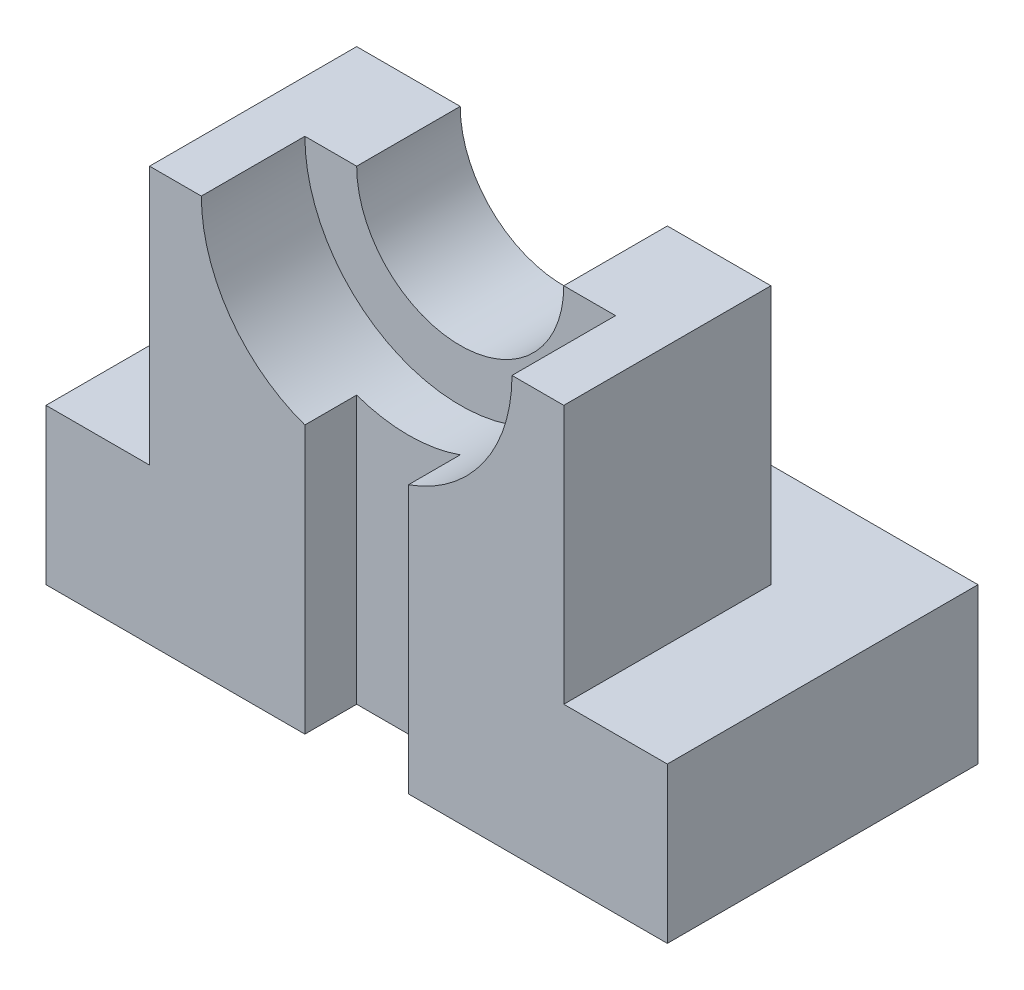
ISO-10303-21;
HEADER;
FILE_DESCRIPTION(('STEP AP214'),'2;1');
FILE_NAME('part.step','',(''),(''),'','','');
FILE_SCHEMA(('AUTOMOTIVE_DESIGN { 1 0 10303 214 1 1 1 1 }'));
ENDSEC;
DATA;
#1=APPLICATION_CONTEXT('core data for automotive mechanical design processes');
#2=APPLICATION_PROTOCOL_DEFINITION('international standard','automotive_design',2000,#1);
#3=PRODUCT_CONTEXT('',#1,'mechanical');
#4=PRODUCT('Part','Part','',(#3));
#5=PRODUCT_RELATED_PRODUCT_CATEGORY('part','',(#4));
#6=PRODUCT_DEFINITION_FORMATION('','',#4);
#7=PRODUCT_DEFINITION_CONTEXT('part definition',#1,'design');
#8=PRODUCT_DEFINITION('design','',#6,#7);
#9=PRODUCT_DEFINITION_SHAPE('','',#8);
#10=(LENGTH_UNIT() NAMED_UNIT(*) SI_UNIT(.MILLI.,.METRE.));
#11=(NAMED_UNIT(*) PLANE_ANGLE_UNIT() SI_UNIT($,.RADIAN.));
#12=(NAMED_UNIT(*) SI_UNIT($,.STERADIAN.) SOLID_ANGLE_UNIT());
#13=UNCERTAINTY_MEASURE_WITH_UNIT(LENGTH_MEASURE(1.E-05),#10,'distance_accuracy_value','');
#14=(GEOMETRIC_REPRESENTATION_CONTEXT(3) GLOBAL_UNCERTAINTY_ASSIGNED_CONTEXT((#13)) GLOBAL_UNIT_ASSIGNED_CONTEXT((#10,
#11,#12)) REPRESENTATION_CONTEXT('',''));
#15=CARTESIAN_POINT('',(0.,0.,0.));
#16=DIRECTION('',(0.,0.,1.));
#17=DIRECTION('',(1.,0.,0.));
#18=AXIS2_PLACEMENT_3D('',#15,#16,#17);
#19=CARTESIAN_POINT('',(0.,0.,-10.));
#20=DIRECTION('',(0.,0.,1.));
#21=DIRECTION('',(1.,0.,0.));
#22=AXIS2_PLACEMENT_3D('',#19,#20,#21);
#23=CYLINDRICAL_SURFACE('',#22,10.);
#24=CARTESIAN_POINT('',(0.,0.,10.));
#25=DIRECTION('',(0.,0.,1.));
#26=DIRECTION('',(1.,0.,0.));
#27=AXIS2_PLACEMENT_3D('',#24,#25,#26);
#28=CIRCLE('',#27,10.);
#29=CARTESIAN_POINT('',(10.,0.,10.));
#30=VERTEX_POINT('',#29);
#31=CARTESIAN_POINT('',(-10.,0.,10.));
#32=VERTEX_POINT('',#31);
#33=EDGE_CURVE('E11',#30,#32,#28,.F.);
#34=ORIENTED_EDGE('',*,*,#33,.F.);
#35=DIRECTION('',(0.,0.,1.));
#36=VECTOR('',#35,1.);
#37=CARTESIAN_POINT('',(10.,0.,-10.));
#38=LINE('',#37,#36);
#39=CARTESIAN_POINT('',(10.,0.,0.));
#40=VERTEX_POINT('',#39);
#41=EDGE_CURVE('E62',#30,#40,#38,.F.);
#42=ORIENTED_EDGE('',*,*,#41,.T.);
#43=CARTESIAN_POINT('',(0.,0.,0.));
#44=DIRECTION('',(0.,0.,1.));
#45=DIRECTION('',(1.,0.,0.));
#46=AXIS2_PLACEMENT_3D('',#43,#44,#45);
#47=CIRCLE('',#46,10.);
#48=CARTESIAN_POINT('',(-10.,0.,0.));
#49=VERTEX_POINT('',#48);
#50=EDGE_CURVE('E207',#49,#40,#47,.T.);
#51=ORIENTED_EDGE('',*,*,#50,.F.);
#52=DIRECTION('',(0.,0.,1.));
#53=VECTOR('',#52,1.);
#54=CARTESIAN_POINT('',(-10.,0.,-10.));
#55=LINE('',#54,#53);
#56=EDGE_CURVE('E229',#49,#32,#55,.T.);
#57=ORIENTED_EDGE('',*,*,#56,.T.);
#58=EDGE_LOOP('',(#34,#42,#51,#57));
#59=FACE_BOUND('',#58,.T.);
#60=ADVANCED_FACE('F39',(#59),#23,.F.);
#61=CARTESIAN_POINT('',(0.,0.,20.));
#62=DIRECTION('',(0.,0.,1.));
#63=DIRECTION('',(1.,0.,0.));
#64=AXIS2_PLACEMENT_3D('',#61,#62,#63);
#65=PLANE('',#64);
#66=CARTESIAN_POINT('',(0.,0.,20.));
#67=DIRECTION('',(0.,0.,1.));
#68=DIRECTION('',(1.,0.,0.));
#69=AXIS2_PLACEMENT_3D('',#66,#67,#68);
#70=CIRCLE('',#69,15.);
#71=CARTESIAN_POINT('',(-15.,0.,20.));
#72=VERTEX_POINT('',#71);
#73=CARTESIAN_POINT('',(-5.,-14.142135623731,20.));
#74=VERTEX_POINT('',#73);
#75=EDGE_CURVE('E160',#72,#74,#70,.T.);
#76=ORIENTED_EDGE('',*,*,#75,.F.);
#77=DIRECTION('',(1.,0.,0.));
#78=VECTOR('',#77,1.);
#79=CARTESIAN_POINT('',(0.,0.,20.));
#80=LINE('',#79,#78);
#81=CARTESIAN_POINT('',(-20.,0.,20.));
#82=VERTEX_POINT('',#81);
#83=EDGE_CURVE('E175',#82,#72,#80,.T.);
#84=ORIENTED_EDGE('',*,*,#83,.F.);
#85=DIRECTION('',(0.,-1.,0.));
#86=VECTOR('',#85,1.);
#87=CARTESIAN_POINT('',(-20.,0.,20.));
#88=LINE('',#87,#86);
#89=CARTESIAN_POINT('',(-20.,-25.,20.));
#90=VERTEX_POINT('',#89);
#91=EDGE_CURVE('E179',#82,#90,#88,.T.);
#92=ORIENTED_EDGE('',*,*,#91,.T.);
#93=DIRECTION('',(-1.,0.,0.));
#94=VECTOR('',#93,1.);
#95=CARTESIAN_POINT('',(0.,-25.,20.));
#96=LINE('',#95,#94);
#97=CARTESIAN_POINT('',(-30.,-25.,20.));
#98=VERTEX_POINT('',#97);
#99=EDGE_CURVE('E244',#90,#98,#96,.T.);
#100=ORIENTED_EDGE('',*,*,#99,.T.);
#101=DIRECTION('',(0.,-1.,0.));
#102=VECTOR('',#101,1.);
#103=CARTESIAN_POINT('',(-30.,0.,20.));
#104=LINE('',#103,#102);
#105=CARTESIAN_POINT('',(-30.,-40.,20.));
#106=VERTEX_POINT('',#105);
#107=EDGE_CURVE('E247',#98,#106,#104,.T.);
#108=ORIENTED_EDGE('',*,*,#107,.T.);
#109=DIRECTION('',(1.,0.,0.));
#110=VECTOR('',#109,1.);
#111=CARTESIAN_POINT('',(0.,-40.,20.));
#112=LINE('',#111,#110);
#113=CARTESIAN_POINT('',(-5.,-40.,20.));
#114=VERTEX_POINT('',#113);
#115=EDGE_CURVE('E250',#106,#114,#112,.T.);
#116=ORIENTED_EDGE('',*,*,#115,.T.);
#117=DIRECTION('',(0.,1.,0.));
#118=VECTOR('',#117,1.);
#119=CARTESIAN_POINT('',(-5.,-40.,20.));
#120=LINE('',#119,#118);
#121=EDGE_CURVE('E222',#114,#74,#120,.T.);
#122=ORIENTED_EDGE('',*,*,#121,.T.);
#123=EDGE_LOOP('',(#76,#84,#92,#100,#108,#116,#122));
#124=FACE_BOUND('',#123,.T.);
#125=ADVANCED_FACE('F294',(#124),#65,.T.);
#126=CARTESIAN_POINT('',(0.,0.,20.));
#127=DIRECTION('',(0.,1.,0.));
#128=DIRECTION('',(0.,0.,1.));
#129=AXIS2_PLACEMENT_3D('',#126,#127,#128);
#130=PLANE('',#129);
#131=DIRECTION('',(0.,0.,1.));
#132=VECTOR('',#131,1.);
#133=CARTESIAN_POINT('',(-15.,0.,10.));
#134=LINE('',#133,#132);
#135=CARTESIAN_POINT('',(-15.,0.,10.));
#136=VERTEX_POINT('',#135);
#137=EDGE_CURVE('E168',#136,#72,#134,.T.);
#138=ORIENTED_EDGE('',*,*,#137,.F.);
#139=DIRECTION('',(1.,0.,0.));
#140=VECTOR('',#139,1.);
#141=CARTESIAN_POINT('',(0.,0.,10.));
#142=LINE('',#141,#140);
#143=EDGE_CURVE('E308',#136,#32,#142,.T.);
#144=ORIENTED_EDGE('',*,*,#143,.T.);
#145=ORIENTED_EDGE('',*,*,#56,.F.);
#146=DIRECTION('',(1.,0.,0.));
#147=VECTOR('',#146,1.);
#148=CARTESIAN_POINT('',(0.,0.,0.));
#149=LINE('',#148,#147);
#150=CARTESIAN_POINT('',(-20.,0.,0.));
#151=VERTEX_POINT('',#150);
#152=EDGE_CURVE('E190',#151,#49,#149,.T.);
#153=ORIENTED_EDGE('',*,*,#152,.F.);
#154=DIRECTION('',(0.,0.,-1.));
#155=VECTOR('',#154,1.);
#156=CARTESIAN_POINT('',(-20.,0.,20.));
#157=LINE('',#156,#155);
#158=EDGE_CURVE('E205',#82,#151,#157,.T.);
#159=ORIENTED_EDGE('',*,*,#158,.F.);
#160=ORIENTED_EDGE('',*,*,#83,.T.);
#161=EDGE_LOOP('',(#138,#144,#145,#153,#159,#160));
#162=FACE_BOUND('',#161,.T.);
#163=ADVANCED_FACE('F306',(#162),#130,.T.);
#164=DIRECTION('',(0.,0.,1.));
#165=VECTOR('',#164,1.);
#166=CARTESIAN_POINT('',(15.,0.,10.));
#167=LINE('',#166,#165);
#168=CARTESIAN_POINT('',(15.,0.,20.));
#169=VERTEX_POINT('',#168);
#170=CARTESIAN_POINT('',(15.,0.,10.));
#171=VERTEX_POINT('',#170);
#172=EDGE_CURVE('E154',#169,#171,#167,.F.);
#173=ORIENTED_EDGE('',*,*,#172,.F.);
#174=CARTESIAN_POINT('',(20.,0.,20.));
#175=VERTEX_POINT('',#174);
#176=EDGE_CURVE('E165',#169,#175,#80,.T.);
#177=ORIENTED_EDGE('',*,*,#176,.T.);
#178=DIRECTION('',(0.,0.,-1.));
#179=VECTOR('',#178,1.);
#180=CARTESIAN_POINT('',(20.,0.,20.));
#181=LINE('',#180,#179);
#182=CARTESIAN_POINT('',(20.,0.,0.));
#183=VERTEX_POINT('',#182);
#184=EDGE_CURVE('E189',#175,#183,#181,.T.);
#185=ORIENTED_EDGE('',*,*,#184,.T.);
#186=EDGE_CURVE('E194',#40,#183,#149,.T.);
#187=ORIENTED_EDGE('',*,*,#186,.F.);
#188=ORIENTED_EDGE('',*,*,#41,.F.);
#189=DIRECTION('',(1.,0.,0.));
#190=VECTOR('',#189,1.);
#191=CARTESIAN_POINT('',(0.,0.,10.));
#192=LINE('',#191,#190);
#193=EDGE_CURVE('E167',#30,#171,#192,.T.);
#194=ORIENTED_EDGE('',*,*,#193,.T.);
#195=EDGE_LOOP('',(#173,#177,#185,#187,#188,#194));
#196=FACE_BOUND('',#195,.T.);
#197=ADVANCED_FACE('F41',(#196),#130,.T.);
#198=CARTESIAN_POINT('',(-20.,0.,20.));
#199=DIRECTION('',(1.,0.,0.));
#200=DIRECTION('',(0.,1.,0.));
#201=AXIS2_PLACEMENT_3D('',#198,#199,#200);
#202=PLANE('',#201);
#203=DIRECTION('',(0.,-1.,0.));
#204=VECTOR('',#203,1.);
#205=CARTESIAN_POINT('',(-20.,0.,0.));
#206=LINE('',#205,#204);
#207=CARTESIAN_POINT('',(-20.,-25.,0.));
#208=VERTEX_POINT('',#207);
#209=EDGE_CURVE('E193',#151,#208,#206,.T.);
#210=ORIENTED_EDGE('',*,*,#209,.T.);
#211=DIRECTION('',(0.,0.,-1.));
#212=VECTOR('',#211,1.);
#213=CARTESIAN_POINT('',(-20.,-25.,20.));
#214=LINE('',#213,#212);
#215=EDGE_CURVE('E202',#90,#208,#214,.T.);
#216=ORIENTED_EDGE('',*,*,#215,.F.);
#217=ORIENTED_EDGE('',*,*,#91,.F.);
#218=ORIENTED_EDGE('',*,*,#158,.T.);
#219=EDGE_LOOP('',(#210,#216,#217,#218));
#220=FACE_BOUND('',#219,.T.);
#221=ADVANCED_FACE('F300',(#220),#202,.F.);
#222=CARTESIAN_POINT('',(20.,0.,20.));
#223=DIRECTION('',(1.,0.,0.));
#224=DIRECTION('',(0.,1.,0.));
#225=AXIS2_PLACEMENT_3D('',#222,#223,#224);
#226=PLANE('',#225);
#227=DIRECTION('',(0.,-1.,0.));
#228=VECTOR('',#227,1.);
#229=CARTESIAN_POINT('',(20.,0.,0.));
#230=LINE('',#229,#228);
#231=CARTESIAN_POINT('',(20.,-25.,0.));
#232=VERTEX_POINT('',#231);
#233=EDGE_CURVE('E176',#183,#232,#230,.T.);
#234=ORIENTED_EDGE('',*,*,#233,.F.);
#235=ORIENTED_EDGE('',*,*,#184,.F.);
#236=DIRECTION('',(0.,-1.,0.));
#237=VECTOR('',#236,1.);
#238=CARTESIAN_POINT('',(20.,0.,20.));
#239=LINE('',#238,#237);
#240=CARTESIAN_POINT('',(20.,-25.,20.));
#241=VERTEX_POINT('',#240);
#242=EDGE_CURVE('E174',#175,#241,#239,.T.);
#243=ORIENTED_EDGE('',*,*,#242,.T.);
#244=DIRECTION('',(0.,0.,-1.));
#245=VECTOR('',#244,1.);
#246=CARTESIAN_POINT('',(20.,-25.,20.));
#247=LINE('',#246,#245);
#248=EDGE_CURVE('E200',#241,#232,#247,.T.);
#249=ORIENTED_EDGE('',*,*,#248,.T.);
#250=EDGE_LOOP('',(#234,#235,#243,#249));
#251=FACE_BOUND('',#250,.T.);
#252=ADVANCED_FACE('F272',(#251),#226,.T.);
#253=CARTESIAN_POINT('',(5.,-14.142135623731,20.));
#254=VERTEX_POINT('',#253);
#255=EDGE_CURVE('E150',#254,#169,#70,.T.);
#256=ORIENTED_EDGE('',*,*,#255,.F.);
#257=DIRECTION('',(0.,1.,0.));
#258=VECTOR('',#257,1.);
#259=CARTESIAN_POINT('',(5.,-40.,20.));
#260=LINE('',#259,#258);
#261=CARTESIAN_POINT('',(5.,-40.,20.));
#262=VERTEX_POINT('',#261);
#263=EDGE_CURVE('E213',#262,#254,#260,.T.);
#264=ORIENTED_EDGE('',*,*,#263,.F.);
#265=CARTESIAN_POINT('',(30.,-40.,20.));
#266=VERTEX_POINT('',#265);
#267=EDGE_CURVE('E249',#262,#266,#112,.T.);
#268=ORIENTED_EDGE('',*,*,#267,.T.);
#269=DIRECTION('',(0.,1.,0.));
#270=VECTOR('',#269,1.);
#271=CARTESIAN_POINT('',(30.,0.,20.));
#272=LINE('',#271,#270);
#273=CARTESIAN_POINT('',(30.,-25.,20.));
#274=VERTEX_POINT('',#273);
#275=EDGE_CURVE('E253',#266,#274,#272,.T.);
#276=ORIENTED_EDGE('',*,*,#275,.T.);
#277=EDGE_CURVE('E245',#274,#241,#96,.T.);
#278=ORIENTED_EDGE('',*,*,#277,.T.);
#279=ORIENTED_EDGE('',*,*,#242,.F.);
#280=ORIENTED_EDGE('',*,*,#176,.F.);
#281=EDGE_LOOP('',(#256,#264,#268,#276,#278,#279,#280));
#282=FACE_BOUND('',#281,.T.);
#283=ADVANCED_FACE('F172',(#282),#65,.T.);
#284=CARTESIAN_POINT('',(0.,0.,0.));
#285=DIRECTION('',(0.,0.,1.));
#286=DIRECTION('',(1.,0.,0.));
#287=AXIS2_PLACEMENT_3D('',#284,#285,#286);
#288=PLANE('',#287);
#289=ORIENTED_EDGE('',*,*,#152,.T.);
#290=ORIENTED_EDGE('',*,*,#50,.T.);
#291=ORIENTED_EDGE('',*,*,#186,.T.);
#292=ORIENTED_EDGE('',*,*,#233,.T.);
#293=DIRECTION('',(1.,0.,0.));
#294=VECTOR('',#293,1.);
#295=CARTESIAN_POINT('',(0.,-25.,0.));
#296=LINE('',#295,#294);
#297=EDGE_CURVE('E181',#208,#232,#296,.T.);
#298=ORIENTED_EDGE('',*,*,#297,.F.);
#299=ORIENTED_EDGE('',*,*,#209,.F.);
#300=EDGE_LOOP('',(#289,#290,#291,#292,#298,#299));
#301=FACE_BOUND('',#300,.T.);
#302=ADVANCED_FACE('F269',(#301),#288,.F.);
#303=CARTESIAN_POINT('',(0.,-25.,20.));
#304=DIRECTION('',(0.,-1.,0.));
#305=DIRECTION('',(0.,0.,-1.));
#306=AXIS2_PLACEMENT_3D('',#303,#304,#305);
#307=PLANE('',#306);
#308=ORIENTED_EDGE('',*,*,#248,.F.);
#309=ORIENTED_EDGE('',*,*,#277,.F.);
#310=DIRECTION('',(0.,0.,-1.));
#311=VECTOR('',#310,1.);
#312=CARTESIAN_POINT('',(30.,-25.,20.));
#313=LINE('',#312,#311);
#314=CARTESIAN_POINT('',(30.,-25.,-10.));
#315=VERTEX_POINT('',#314);
#316=EDGE_CURVE('E255',#274,#315,#313,.T.);
#317=ORIENTED_EDGE('',*,*,#316,.T.);
#318=DIRECTION('',(-1.,0.,0.));
#319=VECTOR('',#318,1.);
#320=CARTESIAN_POINT('',(0.,-25.,-10.));
#321=LINE('',#320,#319);
#322=CARTESIAN_POINT('',(-30.,-25.,-10.));
#323=VERTEX_POINT('',#322);
#324=EDGE_CURVE('E232',#315,#323,#321,.T.);
#325=ORIENTED_EDGE('',*,*,#324,.T.);
#326=DIRECTION('',(0.,0.,-1.));
#327=VECTOR('',#326,1.);
#328=CARTESIAN_POINT('',(-30.,-25.,20.));
#329=LINE('',#328,#327);
#330=EDGE_CURVE('E185',#98,#323,#329,.T.);
#331=ORIENTED_EDGE('',*,*,#330,.F.);
#332=ORIENTED_EDGE('',*,*,#99,.F.);
#333=ORIENTED_EDGE('',*,*,#215,.T.);
#334=ORIENTED_EDGE('',*,*,#297,.T.);
#335=EDGE_LOOP('',(#308,#309,#317,#325,#331,#332,#333,#334));
#336=FACE_BOUND('',#335,.T.);
#337=ADVANCED_FACE('F276',(#336),#307,.F.);
#338=CARTESIAN_POINT('',(-30.,0.,20.));
#339=DIRECTION('',(1.,0.,0.));
#340=DIRECTION('',(0.,0.,-1.));
#341=AXIS2_PLACEMENT_3D('',#338,#339,#340);
#342=PLANE('',#341);
#343=ORIENTED_EDGE('',*,*,#330,.T.);
#344=DIRECTION('',(0.,-1.,0.));
#345=VECTOR('',#344,1.);
#346=CARTESIAN_POINT('',(-30.,0.,-10.));
#347=LINE('',#346,#345);
#348=CARTESIAN_POINT('',(-30.,-40.,-10.));
#349=VERTEX_POINT('',#348);
#350=EDGE_CURVE('E235',#323,#349,#347,.T.);
#351=ORIENTED_EDGE('',*,*,#350,.T.);
#352=DIRECTION('',(0.,0.,-1.));
#353=VECTOR('',#352,1.);
#354=CARTESIAN_POINT('',(-30.,-40.,20.));
#355=LINE('',#354,#353);
#356=EDGE_CURVE('E258',#106,#349,#355,.T.);
#357=ORIENTED_EDGE('',*,*,#356,.F.);
#358=ORIENTED_EDGE('',*,*,#107,.F.);
#359=EDGE_LOOP('',(#343,#351,#357,#358));
#360=FACE_BOUND('',#359,.T.);
#361=ADVANCED_FACE('F287',(#360),#342,.F.);
#362=CARTESIAN_POINT('',(0.,-40.,20.));
#363=DIRECTION('',(0.,1.,0.));
#364=DIRECTION('',(0.,0.,1.));
#365=AXIS2_PLACEMENT_3D('',#362,#363,#364);
#366=PLANE('',#365);
#367=DIRECTION('',(-1.,0.,0.));
#368=VECTOR('',#367,1.);
#369=CARTESIAN_POINT('',(-5.,-40.,15.));
#370=LINE('',#369,#368);
#371=CARTESIAN_POINT('',(5.,-40.,15.));
#372=VERTEX_POINT('',#371);
#373=CARTESIAN_POINT('',(-5.,-40.,15.));
#374=VERTEX_POINT('',#373);
#375=EDGE_CURVE('E218',#372,#374,#370,.T.);
#376=ORIENTED_EDGE('',*,*,#375,.T.);
#377=DIRECTION('',(0.,0.,1.));
#378=VECTOR('',#377,1.);
#379=CARTESIAN_POINT('',(-5.,-40.,20.));
#380=LINE('',#379,#378);
#381=EDGE_CURVE('E224',#374,#114,#380,.T.);
#382=ORIENTED_EDGE('',*,*,#381,.T.);
#383=ORIENTED_EDGE('',*,*,#115,.F.);
#384=ORIENTED_EDGE('',*,*,#356,.T.);
#385=DIRECTION('',(1.,0.,0.));
#386=VECTOR('',#385,1.);
#387=CARTESIAN_POINT('',(0.,-40.,-10.));
#388=LINE('',#387,#386);
#389=CARTESIAN_POINT('',(30.,-40.,-10.));
#390=VERTEX_POINT('',#389);
#391=EDGE_CURVE('E238',#349,#390,#388,.T.);
#392=ORIENTED_EDGE('',*,*,#391,.T.);
#393=DIRECTION('',(0.,0.,-1.));
#394=VECTOR('',#393,1.);
#395=CARTESIAN_POINT('',(30.,-40.,20.));
#396=LINE('',#395,#394);
#397=EDGE_CURVE('E257',#266,#390,#396,.T.);
#398=ORIENTED_EDGE('',*,*,#397,.F.);
#399=ORIENTED_EDGE('',*,*,#267,.F.);
#400=DIRECTION('',(0.,0.,-1.));
#401=VECTOR('',#400,1.);
#402=CARTESIAN_POINT('',(5.,-40.,15.));
#403=LINE('',#402,#401);
#404=EDGE_CURVE('E313',#262,#372,#403,.T.);
#405=ORIENTED_EDGE('',*,*,#404,.T.);
#406=EDGE_LOOP('',(#376,#382,#383,#384,#392,#398,#399,#405));
#407=FACE_BOUND('',#406,.T.);
#408=ADVANCED_FACE('F289',(#407),#366,.F.);
#409=CARTESIAN_POINT('',(30.,0.,20.));
#410=DIRECTION('',(-1.,0.,0.));
#411=DIRECTION('',(0.,0.,1.));
#412=AXIS2_PLACEMENT_3D('',#409,#410,#411);
#413=PLANE('',#412);
#414=ORIENTED_EDGE('',*,*,#397,.T.);
#415=DIRECTION('',(0.,1.,0.));
#416=VECTOR('',#415,1.);
#417=CARTESIAN_POINT('',(30.,0.,-10.));
#418=LINE('',#417,#416);
#419=EDGE_CURVE('E241',#390,#315,#418,.T.);
#420=ORIENTED_EDGE('',*,*,#419,.T.);
#421=ORIENTED_EDGE('',*,*,#316,.F.);
#422=ORIENTED_EDGE('',*,*,#275,.F.);
#423=EDGE_LOOP('',(#414,#420,#421,#422));
#424=FACE_BOUND('',#423,.T.);
#425=ADVANCED_FACE('F282',(#424),#413,.F.);
#426=CARTESIAN_POINT('',(0.,0.,-10.));
#427=DIRECTION('',(0.,0.,1.));
#428=DIRECTION('',(1.,0.,0.));
#429=AXIS2_PLACEMENT_3D('',#426,#427,#428);
#430=PLANE('',#429);
#431=ORIENTED_EDGE('',*,*,#324,.F.);
#432=ORIENTED_EDGE('',*,*,#419,.F.);
#433=ORIENTED_EDGE('',*,*,#391,.F.);
#434=ORIENTED_EDGE('',*,*,#350,.F.);
#435=EDGE_LOOP('',(#431,#432,#433,#434));
#436=FACE_BOUND('',#435,.T.);
#437=ADVANCED_FACE('F286',(#436),#430,.F.);
#438=CARTESIAN_POINT('',(-5.,-40.,20.));
#439=DIRECTION('',(-1.,0.,0.));
#440=DIRECTION('',(0.,0.,1.));
#441=AXIS2_PLACEMENT_3D('',#438,#439,#440);
#442=PLANE('',#441);
#443=DIRECTION('',(0.,1.,0.));
#444=VECTOR('',#443,1.);
#445=CARTESIAN_POINT('',(-5.,-40.,15.));
#446=LINE('',#445,#444);
#447=CARTESIAN_POINT('',(-5.,-14.142135623731,15.));
#448=VERTEX_POINT('',#447);
#449=EDGE_CURVE('E220',#374,#448,#446,.T.);
#450=ORIENTED_EDGE('',*,*,#449,.T.);
#451=DIRECTION('',(0.,0.,1.));
#452=VECTOR('',#451,1.);
#453=CARTESIAN_POINT('',(-5.,-14.142135623731,10.));
#454=LINE('',#453,#452);
#455=EDGE_CURVE('E169',#448,#74,#454,.T.);
#456=ORIENTED_EDGE('',*,*,#455,.T.);
#457=ORIENTED_EDGE('',*,*,#121,.F.);
#458=ORIENTED_EDGE('',*,*,#381,.F.);
#459=EDGE_LOOP('',(#450,#456,#457,#458));
#460=FACE_BOUND('',#459,.T.);
#461=ADVANCED_FACE('F324',(#460),#442,.F.);
#462=CARTESIAN_POINT('',(-5.,-40.,15.));
#463=DIRECTION('',(0.,0.,-1.));
#464=DIRECTION('',(-1.,0.,0.));
#465=AXIS2_PLACEMENT_3D('',#462,#463,#464);
#466=PLANE('',#465);
#467=DIRECTION('',(0.,1.,0.));
#468=VECTOR('',#467,1.);
#469=CARTESIAN_POINT('',(5.,-40.,15.));
#470=LINE('',#469,#468);
#471=CARTESIAN_POINT('',(5.,-14.1421356237309,15.));
#472=VERTEX_POINT('',#471);
#473=EDGE_CURVE('E211',#372,#472,#470,.T.);
#474=ORIENTED_EDGE('',*,*,#473,.T.);
#475=CARTESIAN_POINT('',(0.,0.,15.));
#476=DIRECTION('',(0.,0.,-1.));
#477=DIRECTION('',(-1.,0.,0.));
#478=AXIS2_PLACEMENT_3D('',#475,#476,#477);
#479=CIRCLE('',#478,15.);
#480=EDGE_CURVE('E54',#472,#448,#479,.T.);
#481=ORIENTED_EDGE('',*,*,#480,.T.);
#482=ORIENTED_EDGE('',*,*,#449,.F.);
#483=ORIENTED_EDGE('',*,*,#375,.F.);
#484=EDGE_LOOP('',(#474,#481,#482,#483));
#485=FACE_BOUND('',#484,.T.);
#486=ADVANCED_FACE('F215',(#485),#466,.F.);
#487=CARTESIAN_POINT('',(5.,-40.,15.));
#488=DIRECTION('',(1.,0.,0.));
#489=DIRECTION('',(0.,0.,-1.));
#490=AXIS2_PLACEMENT_3D('',#487,#488,#489);
#491=PLANE('',#490);
#492=ORIENTED_EDGE('',*,*,#263,.T.);
#493=DIRECTION('',(0.,0.,1.));
#494=VECTOR('',#493,1.);
#495=CARTESIAN_POINT('',(5.,-14.142135623731,10.));
#496=LINE('',#495,#494);
#497=EDGE_CURVE('E47',#254,#472,#496,.F.);
#498=ORIENTED_EDGE('',*,*,#497,.T.);
#499=ORIENTED_EDGE('',*,*,#473,.F.);
#500=ORIENTED_EDGE('',*,*,#404,.F.);
#501=EDGE_LOOP('',(#492,#498,#499,#500));
#502=FACE_BOUND('',#501,.T.);
#503=ADVANCED_FACE('F210',(#502),#491,.F.);
#504=CARTESIAN_POINT('',(0.,0.,10.));
#505=DIRECTION('',(0.,0.,1.));
#506=DIRECTION('',(1.,0.,0.));
#507=AXIS2_PLACEMENT_3D('',#504,#505,#506);
#508=CYLINDRICAL_SURFACE('',#507,15.);
#509=ORIENTED_EDGE('',*,*,#137,.T.);
#510=ORIENTED_EDGE('',*,*,#75,.T.);
#511=ORIENTED_EDGE('',*,*,#455,.F.);
#512=ORIENTED_EDGE('',*,*,#480,.F.);
#513=ORIENTED_EDGE('',*,*,#497,.F.);
#514=ORIENTED_EDGE('',*,*,#255,.T.);
#515=ORIENTED_EDGE('',*,*,#172,.T.);
#516=CARTESIAN_POINT('',(0.,0.,10.));
#517=DIRECTION('',(0.,0.,1.));
#518=DIRECTION('',(1.,0.,0.));
#519=AXIS2_PLACEMENT_3D('',#516,#517,#518);
#520=CIRCLE('',#519,15.);
#521=EDGE_CURVE('E311',#136,#171,#520,.T.);
#522=ORIENTED_EDGE('',*,*,#521,.F.);
#523=EDGE_LOOP('',(#509,#510,#511,#512,#513,#514,#515,#522));
#524=FACE_BOUND('',#523,.T.);
#525=ADVANCED_FACE('F152',(#524),#508,.F.);
#526=CARTESIAN_POINT('',(0.,0.,10.));
#527=DIRECTION('',(0.,0.,1.));
#528=DIRECTION('',(1.,0.,0.));
#529=AXIS2_PLACEMENT_3D('',#526,#527,#528);
#530=PLANE('',#529);
#531=ORIENTED_EDGE('',*,*,#521,.T.);
#532=ORIENTED_EDGE('',*,*,#193,.F.);
#533=ORIENTED_EDGE('',*,*,#33,.T.);
#534=ORIENTED_EDGE('',*,*,#143,.F.);
#535=EDGE_LOOP('',(#531,#532,#533,#534));
#536=FACE_BOUND('',#535,.T.);
#537=ADVANCED_FACE('F310',(#536),#530,.T.);
#538=CLOSED_SHELL('',(#60,#125,#163,#197,#221,#252,#283,#302,#337,#361,#408,#425,#437,#461,#486,
#503,#525,#537));
#539=MANIFOLD_SOLID_BREP('B2',#538);
#540=ADVANCED_BREP_SHAPE_REPRESENTATION('',(#18,#539),#14);
#541=SHAPE_DEFINITION_REPRESENTATION(#9,#540);
ENDSEC;
END-ISO-10303-21;
